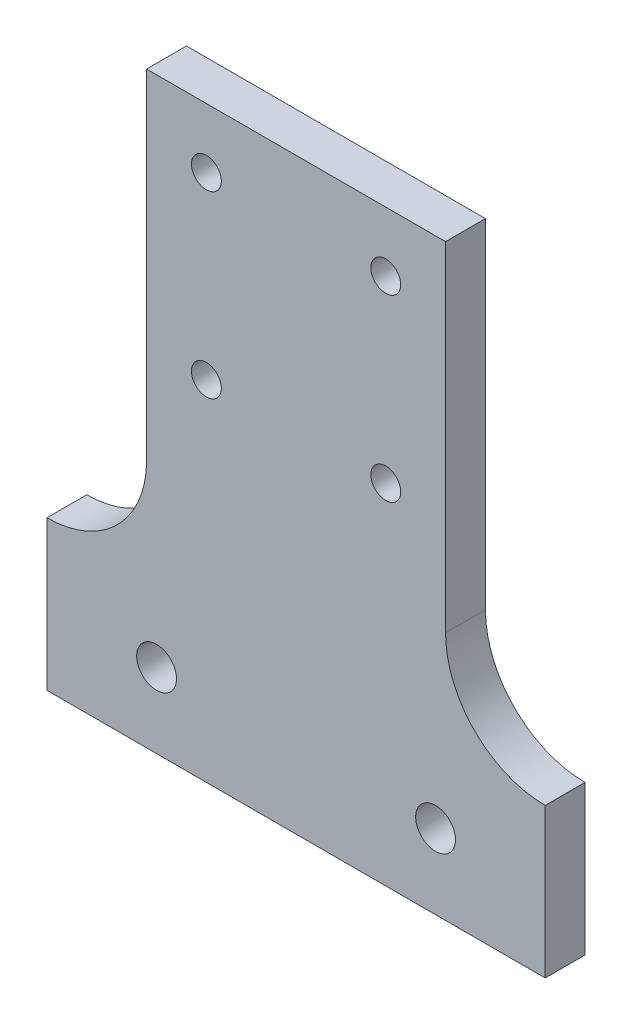
ISO-10303-21;
HEADER;
FILE_DESCRIPTION(('STEP AP214'),'2;1');
FILE_NAME('part.step','',(''),(''),'','','');
FILE_SCHEMA(('AUTOMOTIVE_DESIGN { 1 0 10303 214 1 1 1 1 }'));
ENDSEC;
DATA;
#1=APPLICATION_CONTEXT('core data for automotive mechanical design processes');
#2=APPLICATION_PROTOCOL_DEFINITION('international standard','automotive_design',2000,#1);
#3=PRODUCT_CONTEXT('',#1,'mechanical');
#4=PRODUCT('Part','Part','',(#3));
#5=PRODUCT_RELATED_PRODUCT_CATEGORY('part','',(#4));
#6=PRODUCT_DEFINITION_FORMATION('','',#4);
#7=PRODUCT_DEFINITION_CONTEXT('part definition',#1,'design');
#8=PRODUCT_DEFINITION('design','',#6,#7);
#9=PRODUCT_DEFINITION_SHAPE('','',#8);
#10=(LENGTH_UNIT() NAMED_UNIT(*) SI_UNIT(.MILLI.,.METRE.));
#11=(NAMED_UNIT(*) PLANE_ANGLE_UNIT() SI_UNIT($,.RADIAN.));
#12=(NAMED_UNIT(*) SI_UNIT($,.STERADIAN.) SOLID_ANGLE_UNIT());
#13=UNCERTAINTY_MEASURE_WITH_UNIT(LENGTH_MEASURE(1.E-05),#10,'distance_accuracy_value','');
#14=(GEOMETRIC_REPRESENTATION_CONTEXT(3) GLOBAL_UNCERTAINTY_ASSIGNED_CONTEXT((#13)) GLOBAL_UNIT_ASSIGNED_CONTEXT((#10,
#11,#12)) REPRESENTATION_CONTEXT('',''));
#15=CARTESIAN_POINT('',(0.,0.,0.));
#16=DIRECTION('',(0.,0.,1.));
#17=DIRECTION('',(1.,0.,0.));
#18=AXIS2_PLACEMENT_3D('',#15,#16,#17);
#19=CARTESIAN_POINT('',(25.,0.,4.));
#20=DIRECTION('',(-1.,0.,0.));
#21=DIRECTION('',(0.,0.,1.));
#22=AXIS2_PLACEMENT_3D('',#19,#20,#21);
#23=PLANE('',#22);
#24=DIRECTION('',(0.,1.,0.));
#25=VECTOR('',#24,1.);
#26=CARTESIAN_POINT('',(25.,0.,0.));
#27=LINE('',#26,#25);
#28=CARTESIAN_POINT('',(25.,0.,0.));
#29=VERTEX_POINT('',#28);
#30=CARTESIAN_POINT('',(25.,15.,0.));
#31=VERTEX_POINT('',#30);
#32=EDGE_CURVE('E116',#29,#31,#27,.T.);
#33=ORIENTED_EDGE('',*,*,#32,.T.);
#34=DIRECTION('',(0.,0.,-1.));
#35=VECTOR('',#34,1.);
#36=CARTESIAN_POINT('',(25.,15.,4.));
#37=LINE('',#36,#35);
#38=CARTESIAN_POINT('',(25.,15.,4.));
#39=VERTEX_POINT('',#38);
#40=EDGE_CURVE('E114',#39,#31,#37,.T.);
#41=ORIENTED_EDGE('',*,*,#40,.F.);
#42=DIRECTION('',(0.,1.,0.));
#43=VECTOR('',#42,1.);
#44=CARTESIAN_POINT('',(25.,0.,4.));
#45=LINE('',#44,#43);
#46=CARTESIAN_POINT('',(25.,0.,4.));
#47=VERTEX_POINT('',#46);
#48=EDGE_CURVE('E101',#47,#39,#45,.T.);
#49=ORIENTED_EDGE('',*,*,#48,.F.);
#50=DIRECTION('',(0.,0.,-1.));
#51=VECTOR('',#50,1.);
#52=CARTESIAN_POINT('',(25.,0.,4.));
#53=LINE('',#52,#51);
#54=EDGE_CURVE('E162',#47,#29,#53,.T.);
#55=ORIENTED_EDGE('',*,*,#54,.T.);
#56=EDGE_LOOP('',(#33,#41,#49,#55));
#57=FACE_BOUND('',#56,.T.);
#58=ADVANCED_FACE('F39',(#57),#23,.F.);
#59=CARTESIAN_POINT('',(15.,15.,4.));
#60=DIRECTION('',(-1.,0.,0.));
#61=DIRECTION('',(0.,0.,1.));
#62=AXIS2_PLACEMENT_3D('',#59,#60,#61);
#63=PLANE('',#62);
#64=DIRECTION('',(0.,1.,0.));
#65=VECTOR('',#64,1.);
#66=CARTESIAN_POINT('',(15.,15.,4.));
#67=LINE('',#66,#65);
#68=CARTESIAN_POINT('',(15.,25.,4.));
#69=VERTEX_POINT('',#68);
#70=CARTESIAN_POINT('',(15.,59.,4.));
#71=VERTEX_POINT('',#70);
#72=EDGE_CURVE('E110',#69,#71,#67,.T.);
#73=ORIENTED_EDGE('',*,*,#72,.F.);
#74=DIRECTION('',(0.,0.,-1.));
#75=VECTOR('',#74,1.);
#76=CARTESIAN_POINT('',(15.,25.,0.));
#77=LINE('',#76,#75);
#78=CARTESIAN_POINT('',(15.,25.,0.));
#79=VERTEX_POINT('',#78);
#80=EDGE_CURVE('E121',#69,#79,#77,.T.);
#81=ORIENTED_EDGE('',*,*,#80,.T.);
#82=DIRECTION('',(0.,1.,0.));
#83=VECTOR('',#82,1.);
#84=CARTESIAN_POINT('',(15.,15.,0.));
#85=LINE('',#84,#83);
#86=CARTESIAN_POINT('',(15.,59.,0.));
#87=VERTEX_POINT('',#86);
#88=EDGE_CURVE('E139',#79,#87,#85,.T.);
#89=ORIENTED_EDGE('',*,*,#88,.T.);
#90=DIRECTION('',(0.,0.,-1.));
#91=VECTOR('',#90,1.);
#92=CARTESIAN_POINT('',(15.,59.,4.));
#93=LINE('',#92,#91);
#94=EDGE_CURVE('E119',#71,#87,#93,.T.);
#95=ORIENTED_EDGE('',*,*,#94,.F.);
#96=EDGE_LOOP('',(#73,#81,#89,#95));
#97=FACE_BOUND('',#96,.T.);
#98=ADVANCED_FACE('F183',(#97),#63,.F.);
#99=CARTESIAN_POINT('',(-15.,59.,4.));
#100=DIRECTION('',(0.,-1.,0.));
#101=DIRECTION('',(0.,0.,-1.));
#102=AXIS2_PLACEMENT_3D('',#99,#100,#101);
#103=PLANE('',#102);
#104=DIRECTION('',(-1.,0.,0.));
#105=VECTOR('',#104,1.);
#106=CARTESIAN_POINT('',(-15.,59.,0.));
#107=LINE('',#106,#105);
#108=CARTESIAN_POINT('',(-15.,59.,0.));
#109=VERTEX_POINT('',#108);
#110=EDGE_CURVE('E141',#87,#109,#107,.T.);
#111=ORIENTED_EDGE('',*,*,#110,.T.);
#112=DIRECTION('',(0.,0.,-1.));
#113=VECTOR('',#112,1.);
#114=CARTESIAN_POINT('',(-15.,59.,4.));
#115=LINE('',#114,#113);
#116=CARTESIAN_POINT('',(-15.,59.,4.));
#117=VERTEX_POINT('',#116);
#118=EDGE_CURVE('E173',#117,#109,#115,.T.);
#119=ORIENTED_EDGE('',*,*,#118,.F.);
#120=DIRECTION('',(-1.,0.,0.));
#121=VECTOR('',#120,1.);
#122=CARTESIAN_POINT('',(-15.,59.,4.));
#123=LINE('',#122,#121);
#124=EDGE_CURVE('E182',#71,#117,#123,.T.);
#125=ORIENTED_EDGE('',*,*,#124,.F.);
#126=ORIENTED_EDGE('',*,*,#94,.T.);
#127=EDGE_LOOP('',(#111,#119,#125,#126));
#128=FACE_BOUND('',#127,.T.);
#129=ADVANCED_FACE('F180',(#128),#103,.F.);
#130=CARTESIAN_POINT('',(-15.,15.,4.));
#131=DIRECTION('',(1.,0.,0.));
#132=DIRECTION('',(0.,0.,-1.));
#133=AXIS2_PLACEMENT_3D('',#130,#131,#132);
#134=PLANE('',#133);
#135=DIRECTION('',(0.,-1.,0.));
#136=VECTOR('',#135,1.);
#137=CARTESIAN_POINT('',(-15.,15.,0.));
#138=LINE('',#137,#136);
#139=CARTESIAN_POINT('',(-15.,25.,0.));
#140=VERTEX_POINT('',#139);
#141=EDGE_CURVE('E148',#109,#140,#138,.T.);
#142=ORIENTED_EDGE('',*,*,#141,.T.);
#143=DIRECTION('',(0.,0.,-1.));
#144=VECTOR('',#143,1.);
#145=CARTESIAN_POINT('',(-15.,25.,4.));
#146=LINE('',#145,#144);
#147=CARTESIAN_POINT('',(-15.,25.,4.));
#148=VERTEX_POINT('',#147);
#149=EDGE_CURVE('E118',#140,#148,#146,.F.);
#150=ORIENTED_EDGE('',*,*,#149,.T.);
#151=DIRECTION('',(0.,-1.,0.));
#152=VECTOR('',#151,1.);
#153=CARTESIAN_POINT('',(-15.,15.,4.));
#154=LINE('',#153,#152);
#155=EDGE_CURVE('E187',#117,#148,#154,.T.);
#156=ORIENTED_EDGE('',*,*,#155,.F.);
#157=ORIENTED_EDGE('',*,*,#118,.T.);
#158=EDGE_LOOP('',(#142,#150,#156,#157));
#159=FACE_BOUND('',#158,.T.);
#160=ADVANCED_FACE('F209',(#159),#134,.F.);
#161=CARTESIAN_POINT('',(-25.,0.,4.));
#162=DIRECTION('',(1.,0.,0.));
#163=DIRECTION('',(0.,0.,-1.));
#164=AXIS2_PLACEMENT_3D('',#161,#162,#163);
#165=PLANE('',#164);
#166=DIRECTION('',(0.,-1.,0.));
#167=VECTOR('',#166,1.);
#168=CARTESIAN_POINT('',(-25.,0.,0.));
#169=LINE('',#168,#167);
#170=CARTESIAN_POINT('',(-25.,15.,0.));
#171=VERTEX_POINT('',#170);
#172=CARTESIAN_POINT('',(-25.,0.,0.));
#173=VERTEX_POINT('',#172);
#174=EDGE_CURVE('E157',#171,#173,#169,.T.);
#175=ORIENTED_EDGE('',*,*,#174,.T.);
#176=DIRECTION('',(0.,0.,-1.));
#177=VECTOR('',#176,1.);
#178=CARTESIAN_POINT('',(-25.,0.,4.));
#179=LINE('',#178,#177);
#180=CARTESIAN_POINT('',(-25.,0.,4.));
#181=VERTEX_POINT('',#180);
#182=EDGE_CURVE('E165',#181,#173,#179,.T.);
#183=ORIENTED_EDGE('',*,*,#182,.F.);
#184=DIRECTION('',(0.,-1.,0.));
#185=VECTOR('',#184,1.);
#186=CARTESIAN_POINT('',(-25.,0.,4.));
#187=LINE('',#186,#185);
#188=CARTESIAN_POINT('',(-25.,15.,4.));
#189=VERTEX_POINT('',#188);
#190=EDGE_CURVE('E194',#189,#181,#187,.T.);
#191=ORIENTED_EDGE('',*,*,#190,.F.);
#192=DIRECTION('',(0.,0.,-1.));
#193=VECTOR('',#192,1.);
#194=CARTESIAN_POINT('',(-25.,15.,4.));
#195=LINE('',#194,#193);
#196=EDGE_CURVE('E169',#189,#171,#195,.T.);
#197=ORIENTED_EDGE('',*,*,#196,.T.);
#198=EDGE_LOOP('',(#175,#183,#191,#197));
#199=FACE_BOUND('',#198,.T.);
#200=ADVANCED_FACE('F202',(#199),#165,.F.);
#201=CARTESIAN_POINT('',(25.,0.,4.));
#202=DIRECTION('',(0.,1.,0.));
#203=DIRECTION('',(0.,0.,1.));
#204=AXIS2_PLACEMENT_3D('',#201,#202,#203);
#205=PLANE('',#204);
#206=DIRECTION('',(1.,0.,0.));
#207=VECTOR('',#206,1.);
#208=CARTESIAN_POINT('',(25.,0.,0.));
#209=LINE('',#208,#207);
#210=EDGE_CURVE('E111',#173,#29,#209,.T.);
#211=ORIENTED_EDGE('',*,*,#210,.T.);
#212=ORIENTED_EDGE('',*,*,#54,.F.);
#213=DIRECTION('',(1.,0.,0.));
#214=VECTOR('',#213,1.);
#215=CARTESIAN_POINT('',(25.,0.,4.));
#216=LINE('',#215,#214);
#217=EDGE_CURVE('E105',#181,#47,#216,.T.);
#218=ORIENTED_EDGE('',*,*,#217,.F.);
#219=ORIENTED_EDGE('',*,*,#182,.T.);
#220=EDGE_LOOP('',(#211,#212,#218,#219));
#221=FACE_BOUND('',#220,.T.);
#222=ADVANCED_FACE('F205',(#221),#205,.F.);
#223=CARTESIAN_POINT('',(0.,0.,4.));
#224=DIRECTION('',(0.,0.,1.));
#225=DIRECTION('',(1.,0.,0.));
#226=AXIS2_PLACEMENT_3D('',#223,#224,#225);
#227=PLANE('',#226);
#228=CARTESIAN_POINT('',(-14.,7.49999999999999,4.));
#229=DIRECTION('',(0.,0.,1.));
#230=DIRECTION('',(1.,0.,0.));
#231=AXIS2_PLACEMENT_3D('',#228,#229,#230);
#232=CIRCLE('',#231,2.);
#233=CARTESIAN_POINT('',(-12.,7.49999999999999,4.));
#234=VERTEX_POINT('',#233);
#235=EDGE_CURVE('E273',#234,#234,#232,.T.);
#236=ORIENTED_EDGE('',*,*,#235,.F.);
#237=EDGE_LOOP('',(#236));
#238=FACE_BOUND('',#237,.T.);
#239=CARTESIAN_POINT('',(14.,7.49999999999999,4.));
#240=DIRECTION('',(0.,0.,1.));
#241=DIRECTION('',(-1.,0.,0.));
#242=AXIS2_PLACEMENT_3D('',#239,#240,#241);
#243=CIRCLE('',#242,2.);
#244=CARTESIAN_POINT('',(12.,7.49999999999999,4.));
#245=VERTEX_POINT('',#244);
#246=EDGE_CURVE('E268',#245,#245,#243,.T.);
#247=ORIENTED_EDGE('',*,*,#246,.F.);
#248=EDGE_LOOP('',(#247));
#249=FACE_BOUND('',#248,.T.);
#250=CARTESIAN_POINT('',(9.,53.,4.));
#251=DIRECTION('',(0.,0.,1.));
#252=DIRECTION('',(1.,0.,0.));
#253=AXIS2_PLACEMENT_3D('',#250,#251,#252);
#254=CIRCLE('',#253,1.5);
#255=CARTESIAN_POINT('',(10.5,53.,4.));
#256=VERTEX_POINT('',#255);
#257=EDGE_CURVE('E298',#256,#256,#254,.T.);
#258=ORIENTED_EDGE('',*,*,#257,.F.);
#259=EDGE_LOOP('',(#258));
#260=FACE_BOUND('',#259,.T.);
#261=CARTESIAN_POINT('',(9.,35.,4.));
#262=DIRECTION('',(0.,0.,1.));
#263=DIRECTION('',(1.,0.,0.));
#264=AXIS2_PLACEMENT_3D('',#261,#262,#263);
#265=CIRCLE('',#264,1.5);
#266=CARTESIAN_POINT('',(10.5,35.,4.));
#267=VERTEX_POINT('',#266);
#268=EDGE_CURVE('E290',#267,#267,#265,.T.);
#269=ORIENTED_EDGE('',*,*,#268,.F.);
#270=EDGE_LOOP('',(#269));
#271=FACE_BOUND('',#270,.T.);
#272=CARTESIAN_POINT('',(-9.,35.,4.));
#273=DIRECTION('',(0.,0.,1.));
#274=DIRECTION('',(1.,0.,0.));
#275=AXIS2_PLACEMENT_3D('',#272,#273,#274);
#276=CIRCLE('',#275,1.5);
#277=CARTESIAN_POINT('',(-7.5,35.,4.));
#278=VERTEX_POINT('',#277);
#279=EDGE_CURVE('E282',#278,#278,#276,.T.);
#280=ORIENTED_EDGE('',*,*,#279,.F.);
#281=EDGE_LOOP('',(#280));
#282=FACE_BOUND('',#281,.T.);
#283=CARTESIAN_POINT('',(-9.,53.,4.));
#284=DIRECTION('',(0.,0.,1.));
#285=DIRECTION('',(1.,0.,0.));
#286=AXIS2_PLACEMENT_3D('',#283,#284,#285);
#287=CIRCLE('',#286,1.5);
#288=CARTESIAN_POINT('',(-7.5,53.,4.));
#289=VERTEX_POINT('',#288);
#290=EDGE_CURVE('E281',#289,#289,#287,.T.);
#291=ORIENTED_EDGE('',*,*,#290,.F.);
#292=EDGE_LOOP('',(#291));
#293=FACE_BOUND('',#292,.T.);
#294=ORIENTED_EDGE('',*,*,#48,.T.);
#295=CARTESIAN_POINT('',(25.,25.,4.));
#296=DIRECTION('',(0.,0.,1.));
#297=DIRECTION('',(1.,0.,0.));
#298=AXIS2_PLACEMENT_3D('',#295,#296,#297);
#299=CIRCLE('',#298,10.);
#300=EDGE_CURVE('E11',#39,#69,#299,.F.);
#301=ORIENTED_EDGE('',*,*,#300,.T.);
#302=ORIENTED_EDGE('',*,*,#72,.T.);
#303=ORIENTED_EDGE('',*,*,#124,.T.);
#304=ORIENTED_EDGE('',*,*,#155,.T.);
#305=CARTESIAN_POINT('',(-25.,25.,4.));
#306=DIRECTION('',(0.,0.,1.));
#307=DIRECTION('',(1.,0.,0.));
#308=AXIS2_PLACEMENT_3D('',#305,#306,#307);
#309=CIRCLE('',#308,10.);
#310=EDGE_CURVE('E129',#148,#189,#309,.F.);
#311=ORIENTED_EDGE('',*,*,#310,.T.);
#312=ORIENTED_EDGE('',*,*,#190,.T.);
#313=ORIENTED_EDGE('',*,*,#217,.T.);
#314=EDGE_LOOP('',(#294,#301,#302,#303,#304,#311,#312,#313));
#315=FACE_BOUND('',#314,.T.);
#316=ADVANCED_FACE('F103',(#238,#249,#260,#271,#282,#293,#315),#227,.T.);
#317=CARTESIAN_POINT('',(0.,0.,0.));
#318=DIRECTION('',(0.,0.,1.));
#319=DIRECTION('',(1.,0.,0.));
#320=AXIS2_PLACEMENT_3D('',#317,#318,#319);
#321=PLANE('',#320);
#322=CARTESIAN_POINT('',(-14.,7.49999999999999,0.));
#323=DIRECTION('',(0.,0.,1.));
#324=DIRECTION('',(1.,0.,0.));
#325=AXIS2_PLACEMENT_3D('',#322,#323,#324);
#326=CIRCLE('',#325,2.);
#327=CARTESIAN_POINT('',(-12.,7.49999999999999,0.));
#328=VERTEX_POINT('',#327);
#329=EDGE_CURVE('E302',#328,#328,#326,.T.);
#330=ORIENTED_EDGE('',*,*,#329,.T.);
#331=EDGE_LOOP('',(#330));
#332=FACE_BOUND('',#331,.T.);
#333=CARTESIAN_POINT('',(14.,7.49999999999999,0.));
#334=DIRECTION('',(0.,0.,1.));
#335=DIRECTION('',(-1.,0.,0.));
#336=AXIS2_PLACEMENT_3D('',#333,#334,#335);
#337=CIRCLE('',#336,2.);
#338=CARTESIAN_POINT('',(12.,7.49999999999999,0.));
#339=VERTEX_POINT('',#338);
#340=EDGE_CURVE('E265',#339,#339,#337,.T.);
#341=ORIENTED_EDGE('',*,*,#340,.T.);
#342=EDGE_LOOP('',(#341));
#343=FACE_BOUND('',#342,.T.);
#344=CARTESIAN_POINT('',(9.,53.,0.));
#345=DIRECTION('',(0.,0.,1.));
#346=DIRECTION('',(1.,0.,0.));
#347=AXIS2_PLACEMENT_3D('',#344,#345,#346);
#348=CIRCLE('',#347,1.5);
#349=CARTESIAN_POINT('',(10.5,53.,0.));
#350=VERTEX_POINT('',#349);
#351=EDGE_CURVE('E294',#350,#350,#348,.T.);
#352=ORIENTED_EDGE('',*,*,#351,.T.);
#353=EDGE_LOOP('',(#352));
#354=FACE_BOUND('',#353,.T.);
#355=CARTESIAN_POINT('',(9.,35.,0.));
#356=DIRECTION('',(0.,0.,1.));
#357=DIRECTION('',(1.,0.,0.));
#358=AXIS2_PLACEMENT_3D('',#355,#356,#357);
#359=CIRCLE('',#358,1.5);
#360=CARTESIAN_POINT('',(10.5,35.,0.));
#361=VERTEX_POINT('',#360);
#362=EDGE_CURVE('E286',#361,#361,#359,.T.);
#363=ORIENTED_EDGE('',*,*,#362,.T.);
#364=EDGE_LOOP('',(#363));
#365=FACE_BOUND('',#364,.T.);
#366=CARTESIAN_POINT('',(-9.,35.,0.));
#367=DIRECTION('',(0.,0.,1.));
#368=DIRECTION('',(1.,0.,0.));
#369=AXIS2_PLACEMENT_3D('',#366,#367,#368);
#370=CIRCLE('',#369,1.5);
#371=CARTESIAN_POINT('',(-7.5,35.,0.));
#372=VERTEX_POINT('',#371);
#373=EDGE_CURVE('E277',#372,#372,#370,.T.);
#374=ORIENTED_EDGE('',*,*,#373,.T.);
#375=EDGE_LOOP('',(#374));
#376=FACE_BOUND('',#375,.T.);
#377=CARTESIAN_POINT('',(-9.,53.,0.));
#378=DIRECTION('',(0.,0.,1.));
#379=DIRECTION('',(1.,0.,0.));
#380=AXIS2_PLACEMENT_3D('',#377,#378,#379);
#381=CIRCLE('',#380,1.5);
#382=CARTESIAN_POINT('',(-7.5,53.,0.));
#383=VERTEX_POINT('',#382);
#384=EDGE_CURVE('E150',#383,#383,#381,.T.);
#385=ORIENTED_EDGE('',*,*,#384,.T.);
#386=EDGE_LOOP('',(#385));
#387=FACE_BOUND('',#386,.T.);
#388=ORIENTED_EDGE('',*,*,#32,.F.);
#389=ORIENTED_EDGE('',*,*,#210,.F.);
#390=ORIENTED_EDGE('',*,*,#174,.F.);
#391=CARTESIAN_POINT('',(-25.,25.,0.));
#392=DIRECTION('',(0.,0.,1.));
#393=DIRECTION('',(1.,0.,0.));
#394=AXIS2_PLACEMENT_3D('',#391,#392,#393);
#395=CIRCLE('',#394,10.);
#396=EDGE_CURVE('E125',#171,#140,#395,.T.);
#397=ORIENTED_EDGE('',*,*,#396,.T.);
#398=ORIENTED_EDGE('',*,*,#141,.F.);
#399=ORIENTED_EDGE('',*,*,#110,.F.);
#400=ORIENTED_EDGE('',*,*,#88,.F.);
#401=CARTESIAN_POINT('',(25.,25.,0.));
#402=DIRECTION('',(0.,0.,1.));
#403=DIRECTION('',(1.,0.,0.));
#404=AXIS2_PLACEMENT_3D('',#401,#402,#403);
#405=CIRCLE('',#404,10.);
#406=EDGE_CURVE('E48',#79,#31,#405,.T.);
#407=ORIENTED_EDGE('',*,*,#406,.T.);
#408=EDGE_LOOP('',(#388,#389,#390,#397,#398,#399,#400,#407));
#409=FACE_BOUND('',#408,.T.);
#410=ADVANCED_FACE('F136',(#332,#343,#354,#365,#376,#387,#409),#321,.F.);
#411=CARTESIAN_POINT('',(-9.,53.,0.));
#412=DIRECTION('',(0.,0.,1.));
#413=DIRECTION('',(1.,0.,0.));
#414=AXIS2_PLACEMENT_3D('',#411,#412,#413);
#415=CYLINDRICAL_SURFACE('',#414,1.5);
#416=ORIENTED_EDGE('',*,*,#384,.F.);
#417=EDGE_LOOP('',(#416));
#418=FACE_BOUND('',#417,.T.);
#419=ORIENTED_EDGE('',*,*,#290,.T.);
#420=EDGE_LOOP('',(#419));
#421=FACE_BOUND('',#420,.T.);
#422=ADVANCED_FACE('F238',(#418,#421),#415,.F.);
#423=CARTESIAN_POINT('',(-9.,35.,0.));
#424=DIRECTION('',(0.,0.,1.));
#425=DIRECTION('',(1.,0.,0.));
#426=AXIS2_PLACEMENT_3D('',#423,#424,#425);
#427=CYLINDRICAL_SURFACE('',#426,1.5);
#428=ORIENTED_EDGE('',*,*,#373,.F.);
#429=EDGE_LOOP('',(#428));
#430=FACE_BOUND('',#429,.T.);
#431=ORIENTED_EDGE('',*,*,#279,.T.);
#432=EDGE_LOOP('',(#431));
#433=FACE_BOUND('',#432,.T.);
#434=ADVANCED_FACE('F245',(#430,#433),#427,.F.);
#435=CARTESIAN_POINT('',(9.,35.,0.));
#436=DIRECTION('',(0.,0.,1.));
#437=DIRECTION('',(1.,0.,0.));
#438=AXIS2_PLACEMENT_3D('',#435,#436,#437);
#439=CYLINDRICAL_SURFACE('',#438,1.5);
#440=ORIENTED_EDGE('',*,*,#362,.F.);
#441=EDGE_LOOP('',(#440));
#442=FACE_BOUND('',#441,.T.);
#443=ORIENTED_EDGE('',*,*,#268,.T.);
#444=EDGE_LOOP('',(#443));
#445=FACE_BOUND('',#444,.T.);
#446=ADVANCED_FACE('F250',(#442,#445),#439,.F.);
#447=CARTESIAN_POINT('',(9.,53.,0.));
#448=DIRECTION('',(0.,0.,1.));
#449=DIRECTION('',(1.,0.,0.));
#450=AXIS2_PLACEMENT_3D('',#447,#448,#449);
#451=CYLINDRICAL_SURFACE('',#450,1.5);
#452=ORIENTED_EDGE('',*,*,#351,.F.);
#453=EDGE_LOOP('',(#452));
#454=FACE_BOUND('',#453,.T.);
#455=ORIENTED_EDGE('',*,*,#257,.T.);
#456=EDGE_LOOP('',(#455));
#457=FACE_BOUND('',#456,.T.);
#458=ADVANCED_FACE('F247',(#454,#457),#451,.F.);
#459=CARTESIAN_POINT('',(14.,7.49999999999999,0.));
#460=DIRECTION('',(0.,0.,1.));
#461=DIRECTION('',(1.,0.,0.));
#462=AXIS2_PLACEMENT_3D('',#459,#460,#461);
#463=CYLINDRICAL_SURFACE('',#462,2.);
#464=ORIENTED_EDGE('',*,*,#340,.F.);
#465=EDGE_LOOP('',(#464));
#466=FACE_BOUND('',#465,.T.);
#467=ORIENTED_EDGE('',*,*,#246,.T.);
#468=EDGE_LOOP('',(#467));
#469=FACE_BOUND('',#468,.T.);
#470=ADVANCED_FACE('F218',(#466,#469),#463,.F.);
#471=CARTESIAN_POINT('',(-14.,7.49999999999999,0.));
#472=DIRECTION('',(0.,0.,1.));
#473=DIRECTION('',(1.,0.,0.));
#474=AXIS2_PLACEMENT_3D('',#471,#472,#473);
#475=CYLINDRICAL_SURFACE('',#474,2.);
#476=ORIENTED_EDGE('',*,*,#329,.F.);
#477=EDGE_LOOP('',(#476));
#478=FACE_BOUND('',#477,.T.);
#479=ORIENTED_EDGE('',*,*,#235,.T.);
#480=EDGE_LOOP('',(#479));
#481=FACE_BOUND('',#480,.T.);
#482=ADVANCED_FACE('F213',(#478,#481),#475,.F.);
#483=CARTESIAN_POINT('',(-25.,25.,4.));
#484=DIRECTION('',(0.,0.,1.));
#485=DIRECTION('',(1.,0.,0.));
#486=AXIS2_PLACEMENT_3D('',#483,#484,#485);
#487=CYLINDRICAL_SURFACE('',#486,10.);
#488=ORIENTED_EDGE('',*,*,#310,.F.);
#489=ORIENTED_EDGE('',*,*,#149,.F.);
#490=ORIENTED_EDGE('',*,*,#396,.F.);
#491=ORIENTED_EDGE('',*,*,#196,.F.);
#492=EDGE_LOOP('',(#488,#489,#490,#491));
#493=FACE_BOUND('',#492,.T.);
#494=ADVANCED_FACE('F211',(#493),#487,.F.);
#495=CARTESIAN_POINT('',(25.,25.,4.));
#496=DIRECTION('',(0.,0.,1.));
#497=DIRECTION('',(1.,0.,0.));
#498=AXIS2_PLACEMENT_3D('',#495,#496,#497);
#499=CYLINDRICAL_SURFACE('',#498,10.);
#500=ORIENTED_EDGE('',*,*,#300,.F.);
#501=ORIENTED_EDGE('',*,*,#40,.T.);
#502=ORIENTED_EDGE('',*,*,#406,.F.);
#503=ORIENTED_EDGE('',*,*,#80,.F.);
#504=EDGE_LOOP('',(#500,#501,#502,#503));
#505=FACE_BOUND('',#504,.T.);
#506=ADVANCED_FACE('F41',(#505),#499,.F.);
#507=CLOSED_SHELL('',(#58,#98,#129,#160,#200,#222,#316,#410,#422,#434,#446,#458,#470,#482,#494,#506));
#508=MANIFOLD_SOLID_BREP('B2',#507);
#509=ADVANCED_BREP_SHAPE_REPRESENTATION('',(#18,#508),#14);
#510=SHAPE_DEFINITION_REPRESENTATION(#9,#509);
ENDSEC;
END-ISO-10303-21;
